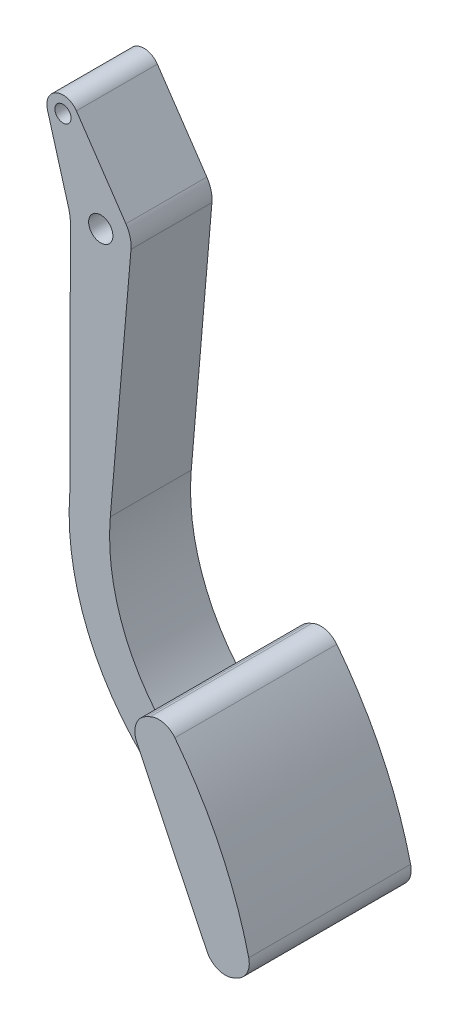
ISO-10303-21;
HEADER;
FILE_DESCRIPTION(('STEP AP214'),'2;1');
FILE_NAME('part.step','',(''),(''),'','','');
FILE_SCHEMA(('AUTOMOTIVE_DESIGN { 1 0 10303 214 1 1 1 1 }'));
ENDSEC;
DATA;
#1=APPLICATION_CONTEXT('core data for automotive mechanical design processes');
#2=APPLICATION_PROTOCOL_DEFINITION('international standard','automotive_design',2000,#1);
#3=PRODUCT_CONTEXT('',#1,'mechanical');
#4=PRODUCT('Part','Part','',(#3));
#5=PRODUCT_RELATED_PRODUCT_CATEGORY('part','',(#4));
#6=PRODUCT_DEFINITION_FORMATION('','',#4);
#7=PRODUCT_DEFINITION_CONTEXT('part definition',#1,'design');
#8=PRODUCT_DEFINITION('design','',#6,#7);
#9=PRODUCT_DEFINITION_SHAPE('','',#8);
#10=(LENGTH_UNIT() NAMED_UNIT(*) SI_UNIT(.MILLI.,.METRE.));
#11=(NAMED_UNIT(*) PLANE_ANGLE_UNIT() SI_UNIT($,.RADIAN.));
#12=(NAMED_UNIT(*) SI_UNIT($,.STERADIAN.) SOLID_ANGLE_UNIT());
#13=UNCERTAINTY_MEASURE_WITH_UNIT(LENGTH_MEASURE(1.E-05),#10,'distance_accuracy_value','');
#14=(GEOMETRIC_REPRESENTATION_CONTEXT(3) GLOBAL_UNCERTAINTY_ASSIGNED_CONTEXT((#13)) GLOBAL_UNIT_ASSIGNED_CONTEXT((#10,
#11,#12)) REPRESENTATION_CONTEXT('',''));
#15=CARTESIAN_POINT('',(0.,0.,0.));
#16=DIRECTION('',(0.,0.,1.));
#17=DIRECTION('',(1.,0.,0.));
#18=AXIS2_PLACEMENT_3D('',#15,#16,#17);
#19=CARTESIAN_POINT('',(-9.32615316309982,60.,10.));
#20=DIRECTION('',(0.,0.,-1.));
#21=DIRECTION('',(-1.,0.,0.));
#22=AXIS2_PLACEMENT_3D('',#19,#20,#21);
#23=CYLINDRICAL_SURFACE('',#22,4.);
#24=CARTESIAN_POINT('',(-9.32615316309982,60.,-10.));
#25=DIRECTION('',(0.,0.,1.));
#26=DIRECTION('',(1.,0.,0.));
#27=AXIS2_PLACEMENT_3D('',#24,#25,#26);
#28=CIRCLE('',#27,4.);
#29=CARTESIAN_POINT('',(-6.01492466320019,62.2440512074043,-10.));
#30=VERTEX_POINT('',#29);
#31=CARTESIAN_POINT('',(-13.1736127731827,58.9059001193763,-10.));
#32=VERTEX_POINT('',#31);
#33=EDGE_CURVE('E407',#30,#32,#28,.T.);
#34=ORIENTED_EDGE('',*,*,#33,.T.);
#35=DIRECTION('',(0.,0.,-1.));
#36=VECTOR('',#35,1.);
#37=CARTESIAN_POINT('',(-13.1736127731827,58.9059001193763,10.));
#38=LINE('',#37,#36);
#39=CARTESIAN_POINT('',(-13.1736127731827,58.9059001193763,10.));
#40=VERTEX_POINT('',#39);
#41=EDGE_CURVE('E247',#40,#32,#38,.T.);
#42=ORIENTED_EDGE('',*,*,#41,.F.);
#43=CARTESIAN_POINT('',(-9.32615316309982,60.,10.));
#44=DIRECTION('',(0.,0.,1.));
#45=DIRECTION('',(1.,0.,0.));
#46=AXIS2_PLACEMENT_3D('',#43,#44,#45);
#47=CIRCLE('',#46,4.);
#48=CARTESIAN_POINT('',(-6.01492466320019,62.2440512074043,10.));
#49=VERTEX_POINT('',#48);
#50=EDGE_CURVE('E372',#49,#40,#47,.T.);
#51=ORIENTED_EDGE('',*,*,#50,.F.);
#52=DIRECTION('',(0.,0.,-1.));
#53=VECTOR('',#52,1.);
#54=CARTESIAN_POINT('',(-6.01492466320019,62.2440512074043,10.));
#55=LINE('',#54,#53);
#56=EDGE_CURVE('E233',#49,#30,#55,.T.);
#57=ORIENTED_EDGE('',*,*,#56,.T.);
#58=EDGE_LOOP('',(#34,#42,#51,#57));
#59=FACE_BOUND('',#58,.T.);
#60=ADVANCED_FACE('F40',(#59),#23,.T.);
#61=CARTESIAN_POINT('',(3.30977598133484,0.941199095782457,10.));
#62=DIRECTION('',(0.961864902520725,0.273524970155918,0.));
#63=DIRECTION('',(-0.273524970155918,0.961864902520725,0.));
#64=AXIS2_PLACEMENT_3D('',#61,#62,#63);
#65=PLANE('',#64);
#66=DIRECTION('',(0.273524970155918,-0.961864902520725,0.));
#67=VECTOR('',#66,1.);
#68=CARTESIAN_POINT('',(3.30977598133484,0.941199095782457,-10.));
#69=LINE('',#68,#67);
#70=CARTESIAN_POINT('',(-7.88621721059133,40.3124963270226,-10.));
#71=VERTEX_POINT('',#70);
#72=EDGE_CURVE('E411',#32,#71,#69,.T.);
#73=ORIENTED_EDGE('',*,*,#72,.T.);
#74=DIRECTION('',(0.,0.,-1.));
#75=VECTOR('',#74,1.);
#76=CARTESIAN_POINT('',(-7.88621721059133,40.3124963270226,10.));
#77=LINE('',#76,#75);
#78=CARTESIAN_POINT('',(-7.88621721059133,40.3124963270226,10.));
#79=VERTEX_POINT('',#78);
#80=EDGE_CURVE('E275',#71,#79,#77,.F.);
#81=ORIENTED_EDGE('',*,*,#80,.T.);
#82=DIRECTION('',(0.273524970155918,-0.961864902520725,0.));
#83=VECTOR('',#82,1.);
#84=CARTESIAN_POINT('',(3.30977598133484,0.941199095782457,10.));
#85=LINE('',#84,#83);
#86=EDGE_CURVE('E368',#40,#79,#85,.T.);
#87=ORIENTED_EDGE('',*,*,#86,.F.);
#88=ORIENTED_EDGE('',*,*,#41,.T.);
#89=EDGE_LOOP('',(#73,#81,#87,#88));
#90=FACE_BOUND('',#89,.T.);
#91=ADVANCED_FACE('F439',(#90),#65,.F.);
#92=CARTESIAN_POINT('',(-7.57975250546952,0.0151154923578921,10.));
#93=DIRECTION('',(0.999998011602289,-0.00199418942655112,0.));
#94=DIRECTION('',(0.00199418942655112,0.999998011602289,0.));
#95=AXIS2_PLACEMENT_3D('',#92,#93,#94);
#96=PLANE('',#95);
#97=DIRECTION('',(-0.00199418942655112,-0.999998011602289,0.));
#98=VECTOR('',#97,1.);
#99=CARTESIAN_POINT('',(-7.57975250546952,0.0151154923578921,-10.));
#100=LINE('',#99,#98);
#101=CARTESIAN_POINT('',(-7.50488611977569,37.5573047311979,-10.));
#102=VERTEX_POINT('',#101);
#103=CARTESIAN_POINT('',(-7.61847553250159,-19.4027740620274,-10.));
#104=VERTEX_POINT('',#103);
#105=EDGE_CURVE('E415',#102,#104,#100,.T.);
#106=ORIENTED_EDGE('',*,*,#105,.T.);
#107=DIRECTION('',(0.,0.,1.));
#108=VECTOR('',#107,1.);
#109=CARTESIAN_POINT('',(-7.61847553250159,-19.4027740620274,10.));
#110=LINE('',#109,#108);
#111=CARTESIAN_POINT('',(-7.61847553250159,-19.4027740620274,10.));
#112=VERTEX_POINT('',#111);
#113=EDGE_CURVE('E288',#104,#112,#110,.T.);
#114=ORIENTED_EDGE('',*,*,#113,.T.);
#115=DIRECTION('',(-0.00199418942655112,-0.999998011602289,0.));
#116=VECTOR('',#115,1.);
#117=CARTESIAN_POINT('',(-7.57975250546952,0.0151154923578921,10.));
#118=LINE('',#117,#116);
#119=CARTESIAN_POINT('',(-7.50488611977569,37.5573047311979,10.));
#120=VERTEX_POINT('',#119);
#121=EDGE_CURVE('E364',#120,#112,#118,.T.);
#122=ORIENTED_EDGE('',*,*,#121,.F.);
#123=DIRECTION('',(0.,0.,-1.));
#124=VECTOR('',#123,1.);
#125=CARTESIAN_POINT('',(-7.50488611977569,37.5573047311979,-10.));
#126=LINE('',#125,#124);
#127=EDGE_CURVE('E251',#120,#102,#126,.T.);
#128=ORIENTED_EDGE('',*,*,#127,.T.);
#129=EDGE_LOOP('',(#106,#114,#122,#128));
#130=FACE_BOUND('',#129,.T.);
#131=ADVANCED_FACE('F427',(#130),#96,.F.);
#132=CARTESIAN_POINT('',(52.1805021531517,-24.6842932682525,10.));
#133=DIRECTION('',(0.,0.,-1.));
#134=DIRECTION('',(-1.,0.,0.));
#135=AXIS2_PLACEMENT_3D('',#132,#133,#134);
#136=CYLINDRICAL_SURFACE('',#135,60.0000000000013);
#137=CARTESIAN_POINT('',(52.1805021531517,-24.6842932682525,10.));
#138=DIRECTION('',(0.,0.,1.));
#139=DIRECTION('',(1.,0.,0.));
#140=AXIS2_PLACEMENT_3D('',#137,#138,#139);
#141=CIRCLE('',#140,60.0000000000013);
#142=CARTESIAN_POINT('',(-7.64717596257095,-20.1401837535462,10.));
#143=VERTEX_POINT('',#142);
#144=CARTESIAN_POINT('',(31.1619417417103,-80.8823369907056,10.));
#145=VERTEX_POINT('',#144);
#146=EDGE_CURVE('E361',#143,#145,#141,.T.);
#147=ORIENTED_EDGE('',*,*,#146,.F.);
#148=DIRECTION('',(0.,0.,-1.));
#149=VECTOR('',#148,1.);
#150=CARTESIAN_POINT('',(-7.64717596257095,-20.1401837535462,10.));
#151=LINE('',#150,#149);
#152=CARTESIAN_POINT('',(-7.64717596257095,-20.1401837535462,-10.));
#153=VERTEX_POINT('',#152);
#154=EDGE_CURVE('E284',#143,#153,#151,.T.);
#155=ORIENTED_EDGE('',*,*,#154,.T.);
#156=CARTESIAN_POINT('',(52.1805021531517,-24.6842932682525,-10.));
#157=DIRECTION('',(0.,0.,1.));
#158=DIRECTION('',(1.,0.,0.));
#159=AXIS2_PLACEMENT_3D('',#156,#157,#158);
#160=CIRCLE('',#159,60.0000000000013);
#161=CARTESIAN_POINT('',(31.1619417417103,-80.8823369907056,-10.));
#162=VERTEX_POINT('',#161);
#163=EDGE_CURVE('E201',#153,#162,#160,.T.);
#164=ORIENTED_EDGE('',*,*,#163,.T.);
#165=DIRECTION('',(0.,0.,-1.));
#166=VECTOR('',#165,1.);
#167=CARTESIAN_POINT('',(31.1619417417103,-80.8823369907056,10.));
#168=LINE('',#167,#166);
#169=EDGE_CURVE('E195',#145,#162,#168,.T.);
#170=ORIENTED_EDGE('',*,*,#169,.F.);
#171=EDGE_LOOP('',(#147,#155,#164,#170));
#172=FACE_BOUND('',#171,.T.);
#173=ADVANCED_FACE('F421',(#172),#136,.T.);
#174=CARTESIAN_POINT('',(52.1805021531517,-24.6842932682525,10.));
#175=DIRECTION('',(0.,0.,-1.));
#176=DIRECTION('',(-1.,0.,0.));
#177=AXIS2_PLACEMENT_3D('',#174,#175,#176);
#178=CYLINDRICAL_SURFACE('',#177,50.);
#179=CARTESIAN_POINT('',(52.1805021531517,-24.6842932682525,-10.));
#180=DIRECTION('',(0.,0.,1.));
#181=DIRECTION('',(1.,0.,0.));
#182=AXIS2_PLACEMENT_3D('',#179,#180,#181);
#183=CIRCLE('',#182,50.);
#184=CARTESIAN_POINT('',(2.36217603709496,-20.4258448425684,-10.));
#185=VERTEX_POINT('',#184);
#186=CARTESIAN_POINT('',(24.,-65.9863428347838,-10.));
#187=VERTEX_POINT('',#186);
#188=EDGE_CURVE('E200',#185,#187,#183,.T.);
#189=ORIENTED_EDGE('',*,*,#188,.F.);
#190=DIRECTION('',(0.,0.,-1.));
#191=VECTOR('',#190,1.);
#192=CARTESIAN_POINT('',(2.36217603709496,-20.4258448425684,10.));
#193=LINE('',#192,#191);
#194=CARTESIAN_POINT('',(2.36217603709496,-20.4258448425684,10.));
#195=VERTEX_POINT('',#194);
#196=EDGE_CURVE('E211',#195,#185,#193,.T.);
#197=ORIENTED_EDGE('',*,*,#196,.F.);
#198=CARTESIAN_POINT('',(52.1805021531517,-24.6842932682525,10.));
#199=DIRECTION('',(0.,0.,1.));
#200=DIRECTION('',(1.,0.,0.));
#201=AXIS2_PLACEMENT_3D('',#198,#199,#200);
#202=CIRCLE('',#201,50.);
#203=CARTESIAN_POINT('',(24.,-65.9863428347838,10.));
#204=VERTEX_POINT('',#203);
#205=EDGE_CURVE('E209',#195,#204,#202,.T.);
#206=ORIENTED_EDGE('',*,*,#205,.T.);
#207=DIRECTION('',(0.,0.,-1.));
#208=VECTOR('',#207,1.);
#209=CARTESIAN_POINT('',(24.,-65.9863428347839,10.));
#210=LINE('',#209,#208);
#211=EDGE_CURVE('E192',#204,#187,#210,.T.);
#212=ORIENTED_EDGE('',*,*,#211,.T.);
#213=EDGE_LOOP('',(#189,#197,#206,#212));
#214=FACE_BOUND('',#213,.T.);
#215=ADVANCED_FACE('F206',(#214),#178,.F.);
#216=CARTESIAN_POINT('',(4.07836855870227,-0.348617135945233,10.));
#217=DIRECTION('',(0.996366522321136,-0.0851689685136824,0.));
#218=DIRECTION('',(0.0851689685136825,0.996366522321136,0.));
#219=AXIS2_PLACEMENT_3D('',#216,#217,#218);
#220=PLANE('',#219);
#221=DIRECTION('',(-0.0851689685136824,-0.996366522321136,0.));
#222=VECTOR('',#221,1.);
#223=CARTESIAN_POINT('',(4.07836855870227,-0.348617135945233,-10.));
#224=LINE('',#223,#222);
#225=CARTESIAN_POINT('',(7.47274891740852,39.3612327361474,-10.));
#226=VERTEX_POINT('',#225);
#227=EDGE_CURVE('E217',#226,#185,#224,.T.);
#228=ORIENTED_EDGE('',*,*,#227,.F.);
#229=DIRECTION('',(0.,0.,-1.));
#230=VECTOR('',#229,1.);
#231=CARTESIAN_POINT('',(7.47274891740852,39.3612327361474,10.));
#232=LINE('',#231,#230);
#233=CARTESIAN_POINT('',(7.47274891740852,39.3612327361474,10.));
#234=VERTEX_POINT('',#233);
#235=EDGE_CURVE('E240',#234,#226,#232,.T.);
#236=ORIENTED_EDGE('',*,*,#235,.F.);
#237=DIRECTION('',(-0.0851689685136824,-0.996366522321136,0.));
#238=VECTOR('',#237,1.);
#239=CARTESIAN_POINT('',(4.07836855870227,-0.348617135945233,10.));
#240=LINE('',#239,#238);
#241=EDGE_CURVE('E352',#234,#195,#240,.T.);
#242=ORIENTED_EDGE('',*,*,#241,.T.);
#243=ORIENTED_EDGE('',*,*,#196,.T.);
#244=EDGE_LOOP('',(#228,#236,#242,#243));
#245=FACE_BOUND('',#244,.T.);
#246=ADVANCED_FACE('F452',(#245),#220,.T.);
#247=CARTESIAN_POINT('',(0.,40.,10.));
#248=DIRECTION('',(0.,0.,-1.));
#249=DIRECTION('',(-1.,0.,0.));
#250=AXIS2_PLACEMENT_3D('',#247,#248,#249);
#251=CYLINDRICAL_SURFACE('',#250,7.5);
#252=CARTESIAN_POINT('',(0.,40.,-10.));
#253=DIRECTION('',(0.,0.,1.));
#254=DIRECTION('',(1.,0.,0.));
#255=AXIS2_PLACEMENT_3D('',#252,#253,#254);
#256=CIRCLE('',#255,7.5);
#257=CARTESIAN_POINT('',(6.20855343731179,44.207596013883,-10.));
#258=VERTEX_POINT('',#257);
#259=EDGE_CURVE('E221',#226,#258,#256,.T.);
#260=ORIENTED_EDGE('',*,*,#259,.T.);
#261=DIRECTION('',(0.,0.,-1.));
#262=VECTOR('',#261,1.);
#263=CARTESIAN_POINT('',(6.20855343731179,44.207596013883,10.));
#264=LINE('',#263,#262);
#265=CARTESIAN_POINT('',(6.20855343731179,44.207596013883,10.));
#266=VERTEX_POINT('',#265);
#267=EDGE_CURVE('E236',#266,#258,#264,.T.);
#268=ORIENTED_EDGE('',*,*,#267,.F.);
#269=CARTESIAN_POINT('',(0.,40.,10.));
#270=DIRECTION('',(0.,0.,1.));
#271=DIRECTION('',(1.,0.,0.));
#272=AXIS2_PLACEMENT_3D('',#269,#270,#271);
#273=CIRCLE('',#272,7.5);
#274=EDGE_CURVE('E349',#234,#266,#273,.T.);
#275=ORIENTED_EDGE('',*,*,#274,.F.);
#276=ORIENTED_EDGE('',*,*,#235,.T.);
#277=EDGE_LOOP('',(#260,#268,#275,#276));
#278=FACE_BOUND('',#277,.T.);
#279=ADVANCED_FACE('F450',(#278),#251,.T.);
#280=CARTESIAN_POINT('',(0.,40.,10.));
#281=DIRECTION('',(0.,0.,-1.));
#282=DIRECTION('',(-1.,0.,0.));
#283=AXIS2_PLACEMENT_3D('',#280,#281,#282);
#284=CYLINDRICAL_SURFACE('',#283,7.5);
#285=CARTESIAN_POINT('',(0.,40.,-10.));
#286=DIRECTION('',(0.,0.,1.));
#287=DIRECTION('',(1.,0.,0.));
#288=AXIS2_PLACEMENT_3D('',#285,#286,#287);
#289=CIRCLE('',#288,7.5);
#290=CARTESIAN_POINT('',(-7.49998508701716,40.014956420699,-10.));
#291=VERTEX_POINT('',#290);
#292=CARTESIAN_POINT('',(-7.5,40.,-10.));
#293=VERTEX_POINT('',#292);
#294=EDGE_CURVE('E394',#291,#293,#289,.T.);
#295=ORIENTED_EDGE('',*,*,#294,.T.);
#296=DIRECTION('',(0.,0.,-1.));
#297=VECTOR('',#296,1.);
#298=CARTESIAN_POINT('',(-7.5,40.,10.));
#299=LINE('',#298,#297);
#300=CARTESIAN_POINT('',(-7.5,40.,10.));
#301=VERTEX_POINT('',#300);
#302=EDGE_CURVE('E237',#301,#293,#299,.T.);
#303=ORIENTED_EDGE('',*,*,#302,.F.);
#304=CARTESIAN_POINT('',(0.,40.,10.));
#305=DIRECTION('',(0.,0.,1.));
#306=DIRECTION('',(1.,0.,0.));
#307=AXIS2_PLACEMENT_3D('',#304,#305,#306);
#308=CIRCLE('',#307,7.5);
#309=CARTESIAN_POINT('',(-7.49998508701716,40.014956420699,10.));
#310=VERTEX_POINT('',#309);
#311=EDGE_CURVE('E232',#310,#301,#308,.T.);
#312=ORIENTED_EDGE('',*,*,#311,.F.);
#313=DIRECTION('',(0.,0.,-1.));
#314=VECTOR('',#313,1.);
#315=CARTESIAN_POINT('',(-7.49998508701716,40.014956420699,10.));
#316=LINE('',#315,#314);
#317=EDGE_CURVE('E252',#310,#291,#316,.T.);
#318=ORIENTED_EDGE('',*,*,#317,.T.);
#319=EDGE_LOOP('',(#295,#303,#312,#318));
#320=FACE_BOUND('',#319,.T.);
#321=ADVANCED_FACE('F460',(#320),#284,.T.);
#322=CARTESIAN_POINT('',(0.,40.,10.));
#323=DIRECTION('',(0.,-1.,0.));
#324=DIRECTION('',(1.,0.,0.));
#325=AXIS2_PLACEMENT_3D('',#322,#323,#324);
#326=PLANE('',#325);
#327=DIRECTION('',(-1.,0.,0.));
#328=VECTOR('',#327,1.);
#329=CARTESIAN_POINT('',(0.,40.,-10.));
#330=LINE('',#329,#328);
#331=CARTESIAN_POINT('',(-7.50001491301249,40.,-10.));
#332=VERTEX_POINT('',#331);
#333=EDGE_CURVE('E398',#293,#332,#330,.T.);
#334=ORIENTED_EDGE('',*,*,#333,.T.);
#335=DIRECTION('',(0.,0.,-1.));
#336=VECTOR('',#335,1.);
#337=CARTESIAN_POINT('',(-7.50001491301249,40.,10.));
#338=LINE('',#337,#336);
#339=CARTESIAN_POINT('',(-7.50001491301249,40.,10.));
#340=VERTEX_POINT('',#339);
#341=EDGE_CURVE('E255',#340,#332,#338,.T.);
#342=ORIENTED_EDGE('',*,*,#341,.F.);
#343=DIRECTION('',(-1.,0.,0.));
#344=VECTOR('',#343,1.);
#345=CARTESIAN_POINT('',(0.,40.,10.));
#346=LINE('',#345,#344);
#347=EDGE_CURVE('E380',#301,#340,#346,.T.);
#348=ORIENTED_EDGE('',*,*,#347,.F.);
#349=ORIENTED_EDGE('',*,*,#302,.T.);
#350=EDGE_LOOP('',(#334,#342,#348,#349));
#351=FACE_BOUND('',#350,.T.);
#352=ADVANCED_FACE('F474',(#351),#326,.F.);
#353=CARTESIAN_POINT('',(-7.57975250546953,0.0151154923578897,10.));
#354=DIRECTION('',(0.999998011602289,-0.0019941894265508,0.));
#355=DIRECTION('',(0.0019941894265508,0.999998011602289,0.));
#356=AXIS2_PLACEMENT_3D('',#353,#354,#355);
#357=PLANE('',#356);
#358=DIRECTION('',(-0.0019941894265508,-0.999998011602289,0.));
#359=VECTOR('',#358,1.);
#360=CARTESIAN_POINT('',(-7.57975250546953,0.0151154923578897,-10.));
#361=LINE('',#360,#359);
#362=EDGE_CURVE('E403',#291,#332,#361,.T.);
#363=ORIENTED_EDGE('',*,*,#362,.F.);
#364=ORIENTED_EDGE('',*,*,#317,.F.);
#365=DIRECTION('',(-0.0019941894265508,-0.999998011602289,0.));
#366=VECTOR('',#365,1.);
#367=CARTESIAN_POINT('',(-7.57975250546953,0.0151154923578897,10.));
#368=LINE('',#367,#366);
#369=EDGE_CURVE('E376',#310,#340,#368,.T.);
#370=ORIENTED_EDGE('',*,*,#369,.T.);
#371=ORIENTED_EDGE('',*,*,#341,.T.);
#372=EDGE_LOOP('',(#363,#364,#370,#371));
#373=FACE_BOUND('',#372,.T.);
#374=ADVANCED_FACE('F471',(#373),#357,.T.);
#375=CARTESIAN_POINT('',(24.7849692202896,16.7970105675142,10.));
#376=DIRECTION('',(0.827807124974905,0.561012801851064,0.));
#377=DIRECTION('',(-0.561012801851064,0.827807124974905,0.));
#378=AXIS2_PLACEMENT_3D('',#375,#376,#377);
#379=PLANE('',#378);
#380=DIRECTION('',(0.561012801851064,-0.827807124974906,0.));
#381=VECTOR('',#380,1.);
#382=CARTESIAN_POINT('',(24.7849692202896,16.7970105675142,-10.));
#383=LINE('',#382,#381);
#384=EDGE_CURVE('E228',#30,#258,#383,.T.);
#385=ORIENTED_EDGE('',*,*,#384,.F.);
#386=ORIENTED_EDGE('',*,*,#56,.F.);
#387=DIRECTION('',(0.561012801851064,-0.827807124974906,0.));
#388=VECTOR('',#387,1.);
#389=CARTESIAN_POINT('',(24.7849692202896,16.7970105675142,10.));
#390=LINE('',#389,#388);
#391=EDGE_CURVE('E256',#49,#266,#390,.T.);
#392=ORIENTED_EDGE('',*,*,#391,.T.);
#393=ORIENTED_EDGE('',*,*,#267,.T.);
#394=EDGE_LOOP('',(#385,#386,#392,#393));
#395=FACE_BOUND('',#394,.T.);
#396=ADVANCED_FACE('F445',(#395),#379,.T.);
#397=CARTESIAN_POINT('',(0.,0.,10.));
#398=DIRECTION('',(0.,0.,1.));
#399=DIRECTION('',(1.,0.,0.));
#400=AXIS2_PLACEMENT_3D('',#397,#398,#399);
#401=PLANE('',#400);
#402=CARTESIAN_POINT('',(-9.32615316309982,60.,10.));
#403=DIRECTION('',(0.,0.,1.));
#404=DIRECTION('',(1.,0.,0.));
#405=AXIS2_PLACEMENT_3D('',#402,#403,#404);
#406=CIRCLE('',#405,2.);
#407=CARTESIAN_POINT('',(-7.32615316309982,60.,10.));
#408=VERTEX_POINT('',#407);
#409=EDGE_CURVE('E267',#408,#408,#406,.T.);
#410=ORIENTED_EDGE('',*,*,#409,.F.);
#411=EDGE_LOOP('',(#410));
#412=FACE_BOUND('',#411,.T.);
#413=CARTESIAN_POINT('',(0.,40.,10.));
#414=DIRECTION('',(0.,0.,1.));
#415=DIRECTION('',(1.,0.,0.));
#416=AXIS2_PLACEMENT_3D('',#413,#414,#415);
#417=CIRCLE('',#416,3.);
#418=CARTESIAN_POINT('',(3.,40.,10.));
#419=VERTEX_POINT('',#418);
#420=EDGE_CURVE('E750',#419,#419,#417,.T.);
#421=ORIENTED_EDGE('',*,*,#420,.F.);
#422=EDGE_LOOP('',(#421));
#423=FACE_BOUND('',#422,.T.);
#424=ORIENTED_EDGE('',*,*,#311,.T.);
#425=ORIENTED_EDGE('',*,*,#347,.T.);
#426=ORIENTED_EDGE('',*,*,#369,.F.);
#427=EDGE_LOOP('',(#424,#425,#426));
#428=FACE_BOUND('',#427,.T.);
#429=ORIENTED_EDGE('',*,*,#50,.T.);
#430=ORIENTED_EDGE('',*,*,#86,.T.);
#431=CARTESIAN_POINT('',(-17.5048662357986,37.5772466254635,10.));
#432=DIRECTION('',(0.,0.,1.));
#433=DIRECTION('',(1.,0.,0.));
#434=AXIS2_PLACEMENT_3D('',#431,#432,#433);
#435=CIRCLE('',#434,10.);
#436=EDGE_CURVE('E281',#79,#120,#435,.F.);
#437=ORIENTED_EDGE('',*,*,#436,.T.);
#438=ORIENTED_EDGE('',*,*,#121,.T.);
#439=CARTESIAN_POINT('',(-17.6184556485245,-19.3828321677619,10.));
#440=DIRECTION('',(0.,0.,1.));
#441=DIRECTION('',(1.,0.,0.));
#442=AXIS2_PLACEMENT_3D('',#439,#440,#441);
#443=CIRCLE('',#442,10.);
#444=EDGE_CURVE('E294',#112,#143,#443,.F.);
#445=ORIENTED_EDGE('',*,*,#444,.T.);
#446=ORIENTED_EDGE('',*,*,#146,.T.);
#447=DIRECTION('',(0.433314391397333,-0.901242829767849,0.));
#448=VECTOR('',#447,1.);
#449=CARTESIAN_POINT('',(-6.27535749313935,-3.01716987156592,10.));
#450=LINE('',#449,#448);
#451=EDGE_CURVE('E358',#204,#145,#450,.T.);
#452=ORIENTED_EDGE('',*,*,#451,.F.);
#453=ORIENTED_EDGE('',*,*,#205,.F.);
#454=ORIENTED_EDGE('',*,*,#241,.F.);
#455=ORIENTED_EDGE('',*,*,#274,.T.);
#456=ORIENTED_EDGE('',*,*,#391,.F.);
#457=EDGE_LOOP('',(#429,#430,#437,#438,#445,#446,#452,#453,#454,#455,#456));
#458=FACE_BOUND('',#457,.T.);
#459=ADVANCED_FACE('F433',(#412,#423,#428,#458),#401,.T.);
#460=CARTESIAN_POINT('',(0.,0.,-10.));
#461=DIRECTION('',(0.,0.,1.));
#462=DIRECTION('',(1.,0.,0.));
#463=AXIS2_PLACEMENT_3D('',#460,#461,#462);
#464=PLANE('',#463);
#465=CARTESIAN_POINT('',(-9.32615316309982,60.,-10.));
#466=DIRECTION('',(0.,0.,1.));
#467=DIRECTION('',(1.,0.,0.));
#468=AXIS2_PLACEMENT_3D('',#465,#466,#467);
#469=CIRCLE('',#468,2.);
#470=CARTESIAN_POINT('',(-7.32615316309982,60.,-10.));
#471=VERTEX_POINT('',#470);
#472=EDGE_CURVE('E266',#471,#471,#469,.T.);
#473=ORIENTED_EDGE('',*,*,#472,.T.);
#474=EDGE_LOOP('',(#473));
#475=FACE_BOUND('',#474,.T.);
#476=CARTESIAN_POINT('',(0.,40.,-10.));
#477=DIRECTION('',(0.,0.,1.));
#478=DIRECTION('',(1.,0.,0.));
#479=AXIS2_PLACEMENT_3D('',#476,#477,#478);
#480=CIRCLE('',#479,3.);
#481=CARTESIAN_POINT('',(3.,40.,-10.));
#482=VERTEX_POINT('',#481);
#483=EDGE_CURVE('E262',#482,#482,#480,.T.);
#484=ORIENTED_EDGE('',*,*,#483,.T.);
#485=EDGE_LOOP('',(#484));
#486=FACE_BOUND('',#485,.T.);
#487=ORIENTED_EDGE('',*,*,#294,.F.);
#488=ORIENTED_EDGE('',*,*,#362,.T.);
#489=ORIENTED_EDGE('',*,*,#333,.F.);
#490=EDGE_LOOP('',(#487,#488,#489));
#491=FACE_BOUND('',#490,.T.);
#492=ORIENTED_EDGE('',*,*,#33,.F.);
#493=ORIENTED_EDGE('',*,*,#384,.T.);
#494=ORIENTED_EDGE('',*,*,#259,.F.);
#495=ORIENTED_EDGE('',*,*,#227,.T.);
#496=ORIENTED_EDGE('',*,*,#188,.T.);
#497=DIRECTION('',(0.433314391397333,-0.901242829767849,0.));
#498=VECTOR('',#497,1.);
#499=CARTESIAN_POINT('',(-6.27535749313935,-3.01716987156592,-10.));
#500=LINE('',#499,#498);
#501=EDGE_CURVE('E188',#187,#162,#500,.T.);
#502=ORIENTED_EDGE('',*,*,#501,.T.);
#503=ORIENTED_EDGE('',*,*,#163,.F.);
#504=CARTESIAN_POINT('',(-17.6184556485245,-19.3828321677619,-10.));
#505=DIRECTION('',(0.,0.,1.));
#506=DIRECTION('',(1.,0.,0.));
#507=AXIS2_PLACEMENT_3D('',#504,#505,#506);
#508=CIRCLE('',#507,10.);
#509=EDGE_CURVE('E291',#153,#104,#508,.T.);
#510=ORIENTED_EDGE('',*,*,#509,.T.);
#511=ORIENTED_EDGE('',*,*,#105,.F.);
#512=CARTESIAN_POINT('',(-17.5048662357986,37.5772466254635,-10.));
#513=DIRECTION('',(0.,0.,1.));
#514=DIRECTION('',(1.,0.,0.));
#515=AXIS2_PLACEMENT_3D('',#512,#513,#514);
#516=CIRCLE('',#515,10.);
#517=EDGE_CURVE('E278',#102,#71,#516,.T.);
#518=ORIENTED_EDGE('',*,*,#517,.T.);
#519=ORIENTED_EDGE('',*,*,#72,.F.);
#520=EDGE_LOOP('',(#492,#493,#494,#495,#496,#502,#503,#510,#511,#518,#519));
#521=FACE_BOUND('',#520,.T.);
#522=ADVANCED_FACE('F214',(#475,#486,#491,#521),#464,.F.);
#523=CARTESIAN_POINT('',(-50.6690625959595,-111.056681537618,20.));
#524=DIRECTION('',(0.,0.,-1.));
#525=DIRECTION('',(-1.,0.,0.));
#526=AXIS2_PLACEMENT_3D('',#523,#524,#525);
#527=CYLINDRICAL_SURFACE('',#526,100.);
#528=CARTESIAN_POINT('',(-50.6690625959595,-111.056681537618,20.));
#529=DIRECTION('',(0.,0.,1.));
#530=DIRECTION('',(1.,0.,0.));
#531=AXIS2_PLACEMENT_3D('',#528,#529,#530);
#532=CIRCLE('',#531,100.);
#533=CARTESIAN_POINT('',(28.3129638866287,-49.7228450955388,20.));
#534=VERTEX_POINT('',#533);
#535=CARTESIAN_POINT('',(46.5577803665164,-87.6699116120798,20.));
#536=VERTEX_POINT('',#535);
#537=EDGE_CURVE('E516',#534,#536,#532,.F.);
#538=ORIENTED_EDGE('',*,*,#537,.T.);
#539=DIRECTION('',(0.,0.,-1.));
#540=VECTOR('',#539,1.);
#541=CARTESIAN_POINT('',(46.5577803665164,-87.6699116120798,20.));
#542=LINE('',#541,#540);
#543=CARTESIAN_POINT('',(46.5577803665164,-87.6699116120798,-20.));
#544=VERTEX_POINT('',#543);
#545=EDGE_CURVE('E311',#536,#544,#542,.T.);
#546=ORIENTED_EDGE('',*,*,#545,.T.);
#547=CARTESIAN_POINT('',(-50.6690625959595,-111.056681537618,-20.));
#548=DIRECTION('',(0.,0.,1.));
#549=DIRECTION('',(1.,0.,0.));
#550=AXIS2_PLACEMENT_3D('',#547,#548,#549);
#551=CIRCLE('',#550,100.);
#552=CARTESIAN_POINT('',(28.3129638866287,-49.7228450955388,-20.));
#553=VERTEX_POINT('',#552);
#554=EDGE_CURVE('E271',#553,#544,#551,.F.);
#555=ORIENTED_EDGE('',*,*,#554,.F.);
#556=DIRECTION('',(0.,0.,-1.));
#557=VECTOR('',#556,1.);
#558=CARTESIAN_POINT('',(28.3129638866287,-49.7228450955388,20.));
#559=LINE('',#558,#557);
#560=EDGE_CURVE('E304',#553,#534,#559,.F.);
#561=ORIENTED_EDGE('',*,*,#560,.T.);
#562=EDGE_LOOP('',(#538,#546,#555,#561));
#563=FACE_BOUND('',#562,.T.);
#564=ADVANCED_FACE('F545',(#563),#527,.T.);
#565=CARTESIAN_POINT('',(23.0234685790612,-47.8860992969826,20.));
#566=DIRECTION('',(-0.433314391397333,0.901242829767849,0.));
#567=DIRECTION('',(-0.901242829767849,-0.433314391397333,0.));
#568=AXIS2_PLACEMENT_3D('',#565,#566,#567);
#569=PLANE('',#568);
#570=DIRECTION('',(0.901242829767849,0.433314391397333,0.));
#571=VECTOR('',#570,1.);
#572=CARTESIAN_POINT('',(23.0234685790612,-47.8860992969826,-20.));
#573=LINE('',#572,#571);
#574=CARTESIAN_POINT('',(21.2543252347611,-48.7366972115619,-20.));
#575=VERTEX_POINT('',#574);
#576=CARTESIAN_POINT('',(22.1972906055126,-48.2833227688035,-20.));
#577=VERTEX_POINT('',#576);
#578=EDGE_CURVE('E530',#575,#577,#573,.T.);
#579=ORIENTED_EDGE('',*,*,#578,.F.);
#580=DIRECTION('',(0.,0.,-1.));
#581=VECTOR('',#580,1.);
#582=CARTESIAN_POINT('',(21.2543252347611,-48.7366972115619,20.));
#583=LINE('',#582,#581);
#584=CARTESIAN_POINT('',(21.2543252347611,-48.7366972115619,20.));
#585=VERTEX_POINT('',#584);
#586=EDGE_CURVE('E333',#575,#585,#583,.F.);
#587=ORIENTED_EDGE('',*,*,#586,.T.);
#588=DIRECTION('',(0.901242829767849,0.433314391397333,0.));
#589=VECTOR('',#588,1.);
#590=CARTESIAN_POINT('',(23.0234685790612,-47.8860992969826,20.));
#591=LINE('',#590,#589);
#592=CARTESIAN_POINT('',(22.1972906055126,-48.2833227688035,20.));
#593=VERTEX_POINT('',#592);
#594=EDGE_CURVE('E510',#585,#593,#591,.T.);
#595=ORIENTED_EDGE('',*,*,#594,.T.);
#596=DIRECTION('',(0.,0.,-1.));
#597=VECTOR('',#596,1.);
#598=CARTESIAN_POINT('',(22.1972906055126,-48.2833227688035,20.));
#599=LINE('',#598,#597);
#600=EDGE_CURVE('E297',#593,#577,#599,.T.);
#601=ORIENTED_EDGE('',*,*,#600,.T.);
#602=EDGE_LOOP('',(#579,#587,#595,#601));
#603=FACE_BOUND('',#602,.T.);
#604=ADVANCED_FACE('F549',(#603),#569,.T.);
#605=CARTESIAN_POINT('',(-6.27535749313935,-3.01716987156592,20.));
#606=DIRECTION('',(-0.901242829767849,-0.433314391397333,0.));
#607=DIRECTION('',(0.433314391397333,-0.901242829767849,0.));
#608=AXIS2_PLACEMENT_3D('',#605,#606,#607);
#609=PLANE('',#608);
#610=ORIENTED_EDGE('',*,*,#211,.F.);
#611=ORIENTED_EDGE('',*,*,#451,.T.);
#612=ORIENTED_EDGE('',*,*,#169,.T.);
#613=ORIENTED_EDGE('',*,*,#501,.F.);
#614=EDGE_LOOP('',(#610,#611,#612,#613));
#615=FACE_BOUND('',#614,.T.);
#616=DIRECTION('',(-0.433314391397333,0.901242829767849,0.));
#617=VECTOR('',#616,1.);
#618=CARTESIAN_POINT('',(-6.27535749313935,-3.01716987156592,-20.));
#619=LINE('',#618,#617);
#620=CARTESIAN_POINT('',(36.2472586988018,-91.4591965081017,-20.));
#621=VERTEX_POINT('',#620);
#622=CARTESIAN_POINT('',(18.9146830429085,-55.4094833173878,-20.));
#623=VERTEX_POINT('',#622);
#624=EDGE_CURVE('E532',#621,#623,#619,.T.);
#625=ORIENTED_EDGE('',*,*,#624,.F.);
#626=DIRECTION('',(0.,0.,-1.));
#627=VECTOR('',#626,1.);
#628=CARTESIAN_POINT('',(36.2472586988018,-91.4591965081017,20.));
#629=LINE('',#628,#627);
#630=CARTESIAN_POINT('',(36.2472586988018,-91.4591965081017,20.));
#631=VERTEX_POINT('',#630);
#632=EDGE_CURVE('E49',#621,#631,#629,.F.);
#633=ORIENTED_EDGE('',*,*,#632,.T.);
#634=DIRECTION('',(-0.433314391397333,0.901242829767849,0.));
#635=VECTOR('',#634,1.);
#636=CARTESIAN_POINT('',(-6.27535749313935,-3.01716987156592,20.));
#637=LINE('',#636,#635);
#638=CARTESIAN_POINT('',(18.9146830429085,-55.4094833173878,20.));
#639=VERTEX_POINT('',#638);
#640=EDGE_CURVE('E508',#631,#639,#637,.T.);
#641=ORIENTED_EDGE('',*,*,#640,.T.);
#642=DIRECTION('',(0.,0.,-1.));
#643=VECTOR('',#642,1.);
#644=CARTESIAN_POINT('',(18.9146830429085,-55.4094833173878,20.));
#645=LINE('',#644,#643);
#646=EDGE_CURVE('E326',#639,#623,#645,.T.);
#647=ORIENTED_EDGE('',*,*,#646,.T.);
#648=EDGE_LOOP('',(#625,#633,#641,#647));
#649=FACE_BOUND('',#648,.T.);
#650=ADVANCED_FACE('F190',(#615,#649),#609,.T.);
#651=CARTESIAN_POINT('',(44.6891881489279,-92.948240785375,20.));
#652=DIRECTION('',(-0.433314391397334,0.901242829767848,0.));
#653=DIRECTION('',(-0.901242829767848,-0.433314391397334,0.));
#654=AXIS2_PLACEMENT_3D('',#651,#652,#653);
#655=PLANE('',#654);
#656=DIRECTION('',(0.901242829767848,0.433314391397334,0.));
#657=VECTOR('',#656,1.);
#658=CARTESIAN_POINT('',(44.6891881489279,-92.948240785375,20.));
#659=LINE('',#658,#657);
#660=CARTESIAN_POINT('',(42.9200448046277,-93.7988386999543,20.));
#661=VERTEX_POINT('',#660);
#662=CARTESIAN_POINT('',(43.8630101753792,-93.345464257196,20.));
#663=VERTEX_POINT('',#662);
#664=EDGE_CURVE('E399',#661,#663,#659,.T.);
#665=ORIENTED_EDGE('',*,*,#664,.F.);
#666=DIRECTION('',(0.,0.,-1.));
#667=VECTOR('',#666,1.);
#668=CARTESIAN_POINT('',(42.9200448046277,-93.7988386999543,-20.));
#669=LINE('',#668,#667);
#670=CARTESIAN_POINT('',(42.9200448046277,-93.7988386999543,-20.));
#671=VERTEX_POINT('',#670);
#672=EDGE_CURVE('E340',#661,#671,#669,.T.);
#673=ORIENTED_EDGE('',*,*,#672,.T.);
#674=DIRECTION('',(0.901242829767848,0.433314391397334,0.));
#675=VECTOR('',#674,1.);
#676=CARTESIAN_POINT('',(44.6891881489279,-92.948240785375,-20.));
#677=LINE('',#676,#675);
#678=CARTESIAN_POINT('',(43.8630101753792,-93.345464257196,-20.));
#679=VERTEX_POINT('',#678);
#680=EDGE_CURVE('E391',#671,#679,#677,.T.);
#681=ORIENTED_EDGE('',*,*,#680,.T.);
#682=DIRECTION('',(0.,0.,1.));
#683=VECTOR('',#682,1.);
#684=CARTESIAN_POINT('',(43.8630101753792,-93.345464257196,20.));
#685=LINE('',#684,#683);
#686=EDGE_CURVE('E319',#679,#663,#685,.T.);
#687=ORIENTED_EDGE('',*,*,#686,.T.);
#688=EDGE_LOOP('',(#665,#673,#681,#687));
#689=FACE_BOUND('',#688,.T.);
#690=ADVANCED_FACE('F537',(#689),#655,.F.);
#691=CARTESIAN_POINT('',(0.,0.,20.));
#692=DIRECTION('',(0.,0.,1.));
#693=DIRECTION('',(1.,0.,0.));
#694=AXIS2_PLACEMENT_3D('',#691,#692,#693);
#695=PLANE('',#694);
#696=ORIENTED_EDGE('',*,*,#640,.F.);
#697=CARTESIAN_POINT('',(40.753472847641,-89.2926245511151,20.));
#698=DIRECTION('',(0.,0.,1.));
#699=DIRECTION('',(1.,0.,0.));
#700=AXIS2_PLACEMENT_3D('',#697,#698,#699);
#701=CIRCLE('',#700,5.);
#702=EDGE_CURVE('E11',#631,#661,#701,.T.);
#703=ORIENTED_EDGE('',*,*,#702,.T.);
#704=ORIENTED_EDGE('',*,*,#664,.T.);
#705=CARTESIAN_POINT('',(41.6964382183926,-88.8392501083567,20.));
#706=DIRECTION('',(0.,0.,1.));
#707=DIRECTION('',(1.,0.,0.));
#708=AXIS2_PLACEMENT_3D('',#705,#706,#707);
#709=CIRCLE('',#708,5.);
#710=EDGE_CURVE('E323',#663,#536,#709,.T.);
#711=ORIENTED_EDGE('',*,*,#710,.T.);
#712=ORIENTED_EDGE('',*,*,#537,.F.);
#713=CARTESIAN_POINT('',(24.3638625624992,-52.7895369176428,20.));
#714=DIRECTION('',(0.,0.,1.));
#715=DIRECTION('',(1.,0.,0.));
#716=AXIS2_PLACEMENT_3D('',#713,#714,#715);
#717=CIRCLE('',#716,5.);
#718=EDGE_CURVE('E307',#534,#593,#717,.T.);
#719=ORIENTED_EDGE('',*,*,#718,.T.);
#720=ORIENTED_EDGE('',*,*,#594,.F.);
#721=CARTESIAN_POINT('',(23.4208971917477,-53.2429113604011,20.));
#722=DIRECTION('',(0.,0.,1.));
#723=DIRECTION('',(1.,0.,0.));
#724=AXIS2_PLACEMENT_3D('',#721,#722,#723);
#725=CIRCLE('',#724,5.);
#726=EDGE_CURVE('E336',#585,#639,#725,.T.);
#727=ORIENTED_EDGE('',*,*,#726,.T.);
#728=EDGE_LOOP('',(#696,#703,#704,#711,#712,#719,#720,#727));
#729=FACE_BOUND('',#728,.T.);
#730=ADVANCED_FACE('F507',(#729),#695,.T.);
#731=CARTESIAN_POINT('',(0.,0.,-20.));
#732=DIRECTION('',(0.,0.,1.));
#733=DIRECTION('',(1.,0.,0.));
#734=AXIS2_PLACEMENT_3D('',#731,#732,#733);
#735=PLANE('',#734);
#736=ORIENTED_EDGE('',*,*,#680,.F.);
#737=CARTESIAN_POINT('',(40.753472847641,-89.2926245511151,-20.));
#738=DIRECTION('',(0.,0.,1.));
#739=DIRECTION('',(1.,0.,0.));
#740=AXIS2_PLACEMENT_3D('',#737,#738,#739);
#741=CIRCLE('',#740,5.);
#742=EDGE_CURVE('E63',#671,#621,#741,.F.);
#743=ORIENTED_EDGE('',*,*,#742,.T.);
#744=ORIENTED_EDGE('',*,*,#624,.T.);
#745=CARTESIAN_POINT('',(23.4208971917477,-53.2429113604011,-20.));
#746=DIRECTION('',(0.,0.,1.));
#747=DIRECTION('',(1.,0.,0.));
#748=AXIS2_PLACEMENT_3D('',#745,#746,#747);
#749=CIRCLE('',#748,5.);
#750=EDGE_CURVE('E330',#623,#575,#749,.F.);
#751=ORIENTED_EDGE('',*,*,#750,.T.);
#752=ORIENTED_EDGE('',*,*,#578,.T.);
#753=CARTESIAN_POINT('',(24.3638625624992,-52.7895369176428,-20.));
#754=DIRECTION('',(0.,0.,1.));
#755=DIRECTION('',(1.,0.,0.));
#756=AXIS2_PLACEMENT_3D('',#753,#754,#755);
#757=CIRCLE('',#756,5.);
#758=EDGE_CURVE('E301',#577,#553,#757,.F.);
#759=ORIENTED_EDGE('',*,*,#758,.T.);
#760=ORIENTED_EDGE('',*,*,#554,.T.);
#761=CARTESIAN_POINT('',(41.6964382183926,-88.8392501083567,-20.));
#762=DIRECTION('',(0.,0.,1.));
#763=DIRECTION('',(1.,0.,0.));
#764=AXIS2_PLACEMENT_3D('',#761,#762,#763);
#765=CIRCLE('',#764,5.);
#766=EDGE_CURVE('E315',#544,#679,#765,.F.);
#767=ORIENTED_EDGE('',*,*,#766,.T.);
#768=EDGE_LOOP('',(#736,#743,#744,#751,#752,#759,#760,#767));
#769=FACE_BOUND('',#768,.T.);
#770=ADVANCED_FACE('F541',(#769),#735,.F.);
#771=CARTESIAN_POINT('',(0.,40.,-30.));
#772=DIRECTION('',(0.,0.,1.));
#773=DIRECTION('',(1.,0.,0.));
#774=AXIS2_PLACEMENT_3D('',#771,#772,#773);
#775=CYLINDRICAL_SURFACE('',#774,3.);
#776=ORIENTED_EDGE('',*,*,#420,.T.);
#777=EDGE_LOOP('',(#776));
#778=FACE_BOUND('',#777,.T.);
#779=ORIENTED_EDGE('',*,*,#483,.F.);
#780=EDGE_LOOP('',(#779));
#781=FACE_BOUND('',#780,.T.);
#782=ADVANCED_FACE('F625',(#778,#781),#775,.F.);
#783=CARTESIAN_POINT('',(-9.32615316309982,60.,-30.));
#784=DIRECTION('',(0.,0.,1.));
#785=DIRECTION('',(1.,0.,0.));
#786=AXIS2_PLACEMENT_3D('',#783,#784,#785);
#787=CYLINDRICAL_SURFACE('',#786,2.);
#788=ORIENTED_EDGE('',*,*,#409,.T.);
#789=EDGE_LOOP('',(#788));
#790=FACE_BOUND('',#789,.T.);
#791=ORIENTED_EDGE('',*,*,#472,.F.);
#792=EDGE_LOOP('',(#791));
#793=FACE_BOUND('',#792,.T.);
#794=ADVANCED_FACE('F484',(#790,#793),#787,.F.);
#795=CARTESIAN_POINT('',(-17.5048662357986,37.5772466254635,10.));
#796=DIRECTION('',(0.,0.,1.));
#797=DIRECTION('',(1.,0.,0.));
#798=AXIS2_PLACEMENT_3D('',#795,#796,#797);
#799=CYLINDRICAL_SURFACE('',#798,10.);
#800=ORIENTED_EDGE('',*,*,#436,.F.);
#801=ORIENTED_EDGE('',*,*,#80,.F.);
#802=ORIENTED_EDGE('',*,*,#517,.F.);
#803=ORIENTED_EDGE('',*,*,#127,.F.);
#804=EDGE_LOOP('',(#800,#801,#802,#803));
#805=FACE_BOUND('',#804,.T.);
#806=ADVANCED_FACE('F436',(#805),#799,.F.);
#807=CARTESIAN_POINT('',(-17.6184556485245,-19.3828321677619,10.));
#808=DIRECTION('',(0.,0.,-1.));
#809=DIRECTION('',(-1.,0.,0.));
#810=AXIS2_PLACEMENT_3D('',#807,#808,#809);
#811=CYLINDRICAL_SURFACE('',#810,10.);
#812=ORIENTED_EDGE('',*,*,#444,.F.);
#813=ORIENTED_EDGE('',*,*,#113,.F.);
#814=ORIENTED_EDGE('',*,*,#509,.F.);
#815=ORIENTED_EDGE('',*,*,#154,.F.);
#816=EDGE_LOOP('',(#812,#813,#814,#815));
#817=FACE_BOUND('',#816,.T.);
#818=ADVANCED_FACE('F431',(#817),#811,.F.);
#819=CARTESIAN_POINT('',(24.3638625624992,-52.7895369176428,20.));
#820=DIRECTION('',(0.,0.,-1.));
#821=DIRECTION('',(-1.,0.,0.));
#822=AXIS2_PLACEMENT_3D('',#819,#820,#821);
#823=CYLINDRICAL_SURFACE('',#822,5.);
#824=ORIENTED_EDGE('',*,*,#718,.F.);
#825=ORIENTED_EDGE('',*,*,#560,.F.);
#826=ORIENTED_EDGE('',*,*,#758,.F.);
#827=ORIENTED_EDGE('',*,*,#600,.F.);
#828=EDGE_LOOP('',(#824,#825,#826,#827));
#829=FACE_BOUND('',#828,.T.);
#830=ADVANCED_FACE('F487',(#829),#823,.T.);
#831=CARTESIAN_POINT('',(41.6964382183926,-88.8392501083567,20.));
#832=DIRECTION('',(0.,0.,-1.));
#833=DIRECTION('',(-1.,0.,0.));
#834=AXIS2_PLACEMENT_3D('',#831,#832,#833);
#835=CYLINDRICAL_SURFACE('',#834,5.);
#836=ORIENTED_EDGE('',*,*,#710,.F.);
#837=ORIENTED_EDGE('',*,*,#686,.F.);
#838=ORIENTED_EDGE('',*,*,#766,.F.);
#839=ORIENTED_EDGE('',*,*,#545,.F.);
#840=EDGE_LOOP('',(#836,#837,#838,#839));
#841=FACE_BOUND('',#840,.T.);
#842=ADVANCED_FACE('F490',(#841),#835,.T.);
#843=CARTESIAN_POINT('',(23.4208971917477,-53.2429113604011,20.));
#844=DIRECTION('',(0.,0.,-1.));
#845=DIRECTION('',(-1.,0.,0.));
#846=AXIS2_PLACEMENT_3D('',#843,#844,#845);
#847=CYLINDRICAL_SURFACE('',#846,5.);
#848=ORIENTED_EDGE('',*,*,#726,.F.);
#849=ORIENTED_EDGE('',*,*,#586,.F.);
#850=ORIENTED_EDGE('',*,*,#750,.F.);
#851=ORIENTED_EDGE('',*,*,#646,.F.);
#852=EDGE_LOOP('',(#848,#849,#850,#851));
#853=FACE_BOUND('',#852,.T.);
#854=ADVANCED_FACE('F493',(#853),#847,.T.);
#855=CARTESIAN_POINT('',(40.753472847641,-89.2926245511151,20.));
#856=DIRECTION('',(0.,0.,1.));
#857=DIRECTION('',(1.,0.,0.));
#858=AXIS2_PLACEMENT_3D('',#855,#856,#857);
#859=CYLINDRICAL_SURFACE('',#858,5.);
#860=ORIENTED_EDGE('',*,*,#702,.F.);
#861=ORIENTED_EDGE('',*,*,#632,.F.);
#862=ORIENTED_EDGE('',*,*,#742,.F.);
#863=ORIENTED_EDGE('',*,*,#672,.F.);
#864=EDGE_LOOP('',(#860,#861,#862,#863));
#865=FACE_BOUND('',#864,.T.);
#866=ADVANCED_FACE('F42',(#865),#859,.T.);
#867=CLOSED_SHELL('',(#60,#91,#131,#173,#215,#246,#279,#321,#352,#374,#396,#459,#522,#564,#604,
#650,#690,#730,#770,#782,#794,#806,#818,#830,#842,#854,#866));
#868=MANIFOLD_SOLID_BREP('B2',#867);
#869=ADVANCED_BREP_SHAPE_REPRESENTATION('',(#18,#868),#14);
#870=SHAPE_DEFINITION_REPRESENTATION(#9,#869);
ENDSEC;
END-ISO-10303-21;
